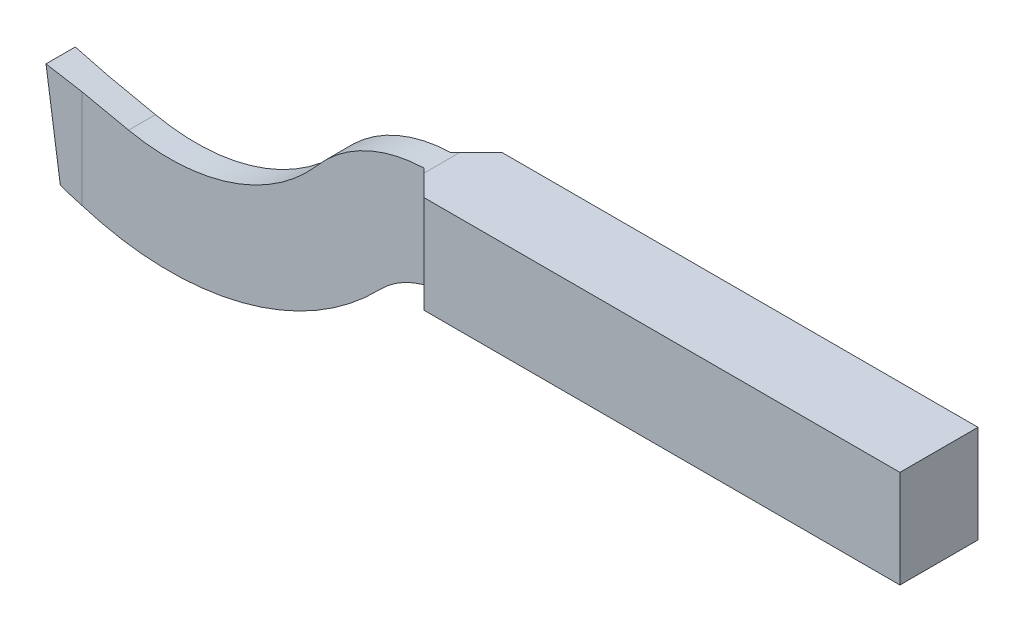
ISO-10303-21;
HEADER;
FILE_DESCRIPTION(('STEP AP214'),'2;1');
FILE_NAME('part.step','',(''),(''),'','','');
FILE_SCHEMA(('AUTOMOTIVE_DESIGN { 1 0 10303 214 1 1 1 1 }'));
ENDSEC;
DATA;
#1=APPLICATION_CONTEXT('core data for automotive mechanical design processes');
#2=APPLICATION_PROTOCOL_DEFINITION('international standard','automotive_design',2000,#1);
#3=PRODUCT_CONTEXT('',#1,'mechanical');
#4=PRODUCT('Part','Part','',(#3));
#5=PRODUCT_RELATED_PRODUCT_CATEGORY('part','',(#4));
#6=PRODUCT_DEFINITION_FORMATION('','',#4);
#7=PRODUCT_DEFINITION_CONTEXT('part definition',#1,'design');
#8=PRODUCT_DEFINITION('design','',#6,#7);
#9=PRODUCT_DEFINITION_SHAPE('','',#8);
#10=(LENGTH_UNIT() NAMED_UNIT(*) SI_UNIT(.MILLI.,.METRE.));
#11=(NAMED_UNIT(*) PLANE_ANGLE_UNIT() SI_UNIT($,.RADIAN.));
#12=(NAMED_UNIT(*) SI_UNIT($,.STERADIAN.) SOLID_ANGLE_UNIT());
#13=UNCERTAINTY_MEASURE_WITH_UNIT(LENGTH_MEASURE(1.E-05),#10,'distance_accuracy_value','');
#14=(GEOMETRIC_REPRESENTATION_CONTEXT(3) GLOBAL_UNCERTAINTY_ASSIGNED_CONTEXT((#13)) GLOBAL_UNIT_ASSIGNED_CONTEXT((#10,
#11,#12)) REPRESENTATION_CONTEXT('',''));
#15=CARTESIAN_POINT('',(0.,0.,0.));
#16=DIRECTION('',(0.,0.,1.));
#17=DIRECTION('',(1.,0.,0.));
#18=AXIS2_PLACEMENT_3D('',#15,#16,#17);
#19=CARTESIAN_POINT('',(0.,0.,32.));
#20=DIRECTION('',(-0.20791169081776,-0.978147600733806,0.));
#21=DIRECTION('',(0.978147600733806,-0.20791169081776,0.));
#22=AXIS2_PLACEMENT_3D('',#19,#20,#21);
#23=PLANE('',#22);
#24=DIRECTION('',(-0.977577474577886,0.20779050676234,0.0341377576500523));
#25=VECTOR('',#24,1.);
#26=CARTESIAN_POINT('',(-0.3337230291129,0.070935019618343,22.0116538649737));
#27=LINE('',#26,#25);
#28=CARTESIAN_POINT('',(14.3181266414594,-3.04341176846456,21.5));
#29=VERTEX_POINT('',#28);
#30=CARTESIAN_POINT('',(0.,-3.53883589099269E-13,22.));
#31=VERTEX_POINT('',#30);
#32=EDGE_CURVE('E139',#29,#31,#27,.T.);
#33=ORIENTED_EDGE('',*,*,#32,.F.);
#34=DIRECTION('',(-0.978147600733806,0.20791169081776,0.));
#35=VECTOR('',#34,1.);
#36=CARTESIAN_POINT('',(0.,0.,21.5));
#37=LINE('',#36,#35);
#38=CARTESIAN_POINT('',(33.3670647345792,-7.09238855300323,21.5));
#39=VERTEX_POINT('',#38);
#40=EDGE_CURVE('E271',#39,#29,#37,.T.);
#41=ORIENTED_EDGE('',*,*,#40,.F.);
#42=DIRECTION('',(0.,0.,-1.));
#43=VECTOR('',#42,1.);
#44=CARTESIAN_POINT('',(33.3670647345792,-7.09238855300323,32.));
#45=LINE('',#44,#43);
#46=CARTESIAN_POINT('',(33.3670647345792,-7.09238855300323,10.5));
#47=VERTEX_POINT('',#46);
#48=EDGE_CURVE('E177',#39,#47,#45,.T.);
#49=ORIENTED_EDGE('',*,*,#48,.T.);
#50=DIRECTION('',(-0.978147600733806,0.20791169081776,0.));
#51=VECTOR('',#50,1.);
#52=CARTESIAN_POINT('',(0.,0.,10.5));
#53=LINE('',#52,#51);
#54=CARTESIAN_POINT('',(14.3181266414591,-3.0434117684645,10.5));
#55=VERTEX_POINT('',#54);
#56=EDGE_CURVE('E189',#47,#55,#53,.T.);
#57=ORIENTED_EDGE('',*,*,#56,.T.);
#58=DIRECTION('',(-0.977577474577885,0.20779050676234,-0.0341377576500593));
#59=VECTOR('',#58,1.);
#60=CARTESIAN_POINT('',(0.73419066404853,-0.156057043160386,10.0256385029422));
#61=LINE('',#60,#59);
#62=CARTESIAN_POINT('',(0.,0.,10.));
#63=VERTEX_POINT('',#62);
#64=EDGE_CURVE('E162',#55,#63,#61,.T.);
#65=ORIENTED_EDGE('',*,*,#64,.T.);
#66=DIRECTION('',(0.,0.,-1.));
#67=VECTOR('',#66,1.);
#68=CARTESIAN_POINT('',(0.,0.,32.));
#69=LINE('',#68,#67);
#70=EDGE_CURVE('E156',#31,#63,#69,.T.);
#71=ORIENTED_EDGE('',*,*,#70,.F.);
#72=EDGE_LOOP('',(#33,#41,#49,#57,#65,#71));
#73=FACE_BOUND('',#72,.T.);
#74=ADVANCED_FACE('F33',(#73),#23,.F.);
#75=CARTESIAN_POINT('',(0.,0.,32.));
#76=DIRECTION('',(0.99026806874157,0.139173100960066,0.));
#77=DIRECTION('',(-0.139173100960066,0.99026806874157,0.));
#78=AXIS2_PLACEMENT_3D('',#75,#76,#77);
#79=PLANE('',#78);
#80=DIRECTION('',(0.139171457361201,-0.990256373927965,-0.0048599743823401));
#81=VECTOR('',#80,1.);
#82=CARTESIAN_POINT('',(-0.00676369717528373,0.0481262060923891,22.00023619351));
#83=LINE('',#82,#81);
#84=CARTESIAN_POINT('',(5.67120540009934,-40.3527231932884,21.8019571434828));
#85=VERTEX_POINT('',#84);
#86=EDGE_CURVE('E142',#31,#85,#83,.T.);
#87=ORIENTED_EDGE('',*,*,#86,.F.);
#88=ORIENTED_EDGE('',*,*,#70,.T.);
#89=DIRECTION('',(0.139171457361201,-0.990256373927965,0.00485997438234109));
#90=VECTOR('',#89,1.);
#91=CARTESIAN_POINT('',(0.0148801337856272,-0.105877653403278,10.0005196257219));
#92=LINE('',#91,#90);
#93=CARTESIAN_POINT('',(5.67120540009934,-40.3527231932884,10.1980428565172));
#94=VERTEX_POINT('',#93);
#95=EDGE_CURVE('E197',#63,#94,#92,.T.);
#96=ORIENTED_EDGE('',*,*,#95,.T.);
#97=DIRECTION('',(0.,0.,-1.));
#98=VECTOR('',#97,1.);
#99=CARTESIAN_POINT('',(5.67120540009934,-40.3527231932884,32.));
#100=LINE('',#99,#98);
#101=EDGE_CURVE('E157',#85,#94,#100,.T.);
#102=ORIENTED_EDGE('',*,*,#101,.F.);
#103=EDGE_LOOP('',(#87,#88,#96,#102));
#104=FACE_BOUND('',#103,.T.);
#105=ADVANCED_FACE('F154',(#104),#79,.F.);
#106=CARTESIAN_POINT('',(50.,71.1594195057012,32.));
#107=DIRECTION('',(0.,0.,-1.));
#108=DIRECTION('',(-1.,0.,0.));
#109=AXIS2_PLACEMENT_3D('',#106,#107,#108);
#110=CYLINDRICAL_SURFACE('',#109,120.);
#111=CARTESIAN_POINT('',(50.,71.1594195057012,20.253961525413));
#112=DIRECTION('',(0.0348994967024939,0.,0.999390827019096));
#113=DIRECTION('',(0.999390827019096,0.,-0.0348994967024939));
#114=AXIS2_PLACEMENT_3D('',#111,#112,#113);
#115=ELLIPSE('',#114,120.073145315859,120.);
#116=CARTESIAN_POINT('',(14.3181266414594,-43.4128455222062,21.5));
#117=VERTEX_POINT('',#116);
#118=EDGE_CURVE('E158',#85,#117,#115,.T.);
#119=ORIENTED_EDGE('',*,*,#118,.F.);
#120=ORIENTED_EDGE('',*,*,#101,.T.);
#121=CARTESIAN_POINT('',(50.,71.1594195057012,11.7460384745874));
#122=DIRECTION('',(-0.034899496702501,0.,0.999390827019096));
#123=DIRECTION('',(-0.999390827019096,0.,-0.034899496702501));
#124=AXIS2_PLACEMENT_3D('',#121,#122,#123);
#125=ELLIPSE('',#124,120.073145315859,120.);
#126=CARTESIAN_POINT('',(14.3181266414591,-43.4128455222061,10.5));
#127=VERTEX_POINT('',#126);
#128=EDGE_CURVE('E259',#94,#127,#125,.T.);
#129=ORIENTED_EDGE('',*,*,#128,.T.);
#130=CARTESIAN_POINT('',(50.,71.1594195057012,10.5));
#131=DIRECTION('',(0.,0.,1.));
#132=DIRECTION('',(1.,0.,0.));
#133=AXIS2_PLACEMENT_3D('',#130,#131,#132);
#134=CIRCLE('',#133,120.);
#135=CARTESIAN_POINT('',(136.310576950481,-12.2101451235747,10.5));
#136=VERTEX_POINT('',#135);
#137=EDGE_CURVE('E203',#127,#136,#134,.T.);
#138=ORIENTED_EDGE('',*,*,#137,.T.);
#139=DIRECTION('',(0.,0.,-1.));
#140=VECTOR('',#139,1.);
#141=CARTESIAN_POINT('',(136.310576950481,-12.2101451235747,32.));
#142=LINE('',#141,#140);
#143=CARTESIAN_POINT('',(136.310576950481,-12.2101451235747,21.5));
#144=VERTEX_POINT('',#143);
#145=EDGE_CURVE('E167',#144,#136,#142,.T.);
#146=ORIENTED_EDGE('',*,*,#145,.F.);
#147=CARTESIAN_POINT('',(50.,71.1594195057012,21.5));
#148=DIRECTION('',(0.,0.,1.));
#149=DIRECTION('',(1.,0.,0.));
#150=AXIS2_PLACEMENT_3D('',#147,#148,#149);
#151=CIRCLE('',#150,120.);
#152=EDGE_CURVE('E265',#117,#144,#151,.T.);
#153=ORIENTED_EDGE('',*,*,#152,.F.);
#154=EDGE_LOOP('',(#119,#120,#129,#138,#146,#153));
#155=FACE_BOUND('',#154,.T.);
#156=ADVANCED_FACE('F257',(#155),#110,.T.);
#157=CARTESIAN_POINT('',(165.080769267309,-40.,32.));
#158=DIRECTION('',(0.,0.,-1.));
#159=DIRECTION('',(-1.,0.,0.));
#160=AXIS2_PLACEMENT_3D('',#157,#158,#159);
#161=CYLINDRICAL_SURFACE('',#160,40.);
#162=CARTESIAN_POINT('',(165.080769267309,-40.,21.5));
#163=DIRECTION('',(0.,0.,1.));
#164=DIRECTION('',(1.,0.,0.));
#165=AXIS2_PLACEMENT_3D('',#162,#163,#164);
#166=CIRCLE('',#165,40.);
#167=CARTESIAN_POINT('',(154.5,-1.42478358178688,21.5));
#168=VERTEX_POINT('',#167);
#169=EDGE_CURVE('E253',#144,#168,#166,.F.);
#170=ORIENTED_EDGE('',*,*,#169,.F.);
#171=ORIENTED_EDGE('',*,*,#145,.T.);
#172=CARTESIAN_POINT('',(165.080769267309,-40.,10.5));
#173=DIRECTION('',(0.,0.,1.));
#174=DIRECTION('',(1.,0.,0.));
#175=AXIS2_PLACEMENT_3D('',#172,#173,#174);
#176=CIRCLE('',#175,40.);
#177=CARTESIAN_POINT('',(154.5,-1.42478358178696,10.5));
#178=VERTEX_POINT('',#177);
#179=EDGE_CURVE('E195',#136,#178,#176,.F.);
#180=ORIENTED_EDGE('',*,*,#179,.T.);
#181=CARTESIAN_POINT('',(165.080769267309,-40.,-0.0807692673088153));
#182=DIRECTION('',(-0.707106781186553,0.,-0.707106781186542));
#183=DIRECTION('',(0.707106781186542,0.,-0.707106781186553));
#184=AXIS2_PLACEMENT_3D('',#181,#182,#183);
#185=ELLIPSE('',#184,56.5685424949243,40.);
#186=CARTESIAN_POINT('',(165.,-8.15460148850811E-05,0.));
#187=VERTEX_POINT('',#186);
#188=EDGE_CURVE('E214',#187,#178,#185,.F.);
#189=ORIENTED_EDGE('',*,*,#188,.F.);
#190=CARTESIAN_POINT('',(165.080769267309,-40.,0.));
#191=DIRECTION('',(0.,0.,-1.));
#192=DIRECTION('',(-1.,0.,0.));
#193=AXIS2_PLACEMENT_3D('',#190,#191,#192);
#194=CIRCLE('',#193,40.);
#195=CARTESIAN_POINT('',(165.080769267309,0.,0.));
#196=VERTEX_POINT('',#195);
#197=EDGE_CURVE('E216',#187,#196,#194,.T.);
#198=ORIENTED_EDGE('',*,*,#197,.T.);
#199=DIRECTION('',(0.,0.,-1.));
#200=VECTOR('',#199,1.);
#201=CARTESIAN_POINT('',(165.080769267309,0.,32.));
#202=LINE('',#201,#200);
#203=CARTESIAN_POINT('',(165.080769267309,0.,32.));
#204=VERTEX_POINT('',#203);
#205=EDGE_CURVE('E244',#204,#196,#202,.T.);
#206=ORIENTED_EDGE('',*,*,#205,.F.);
#207=CARTESIAN_POINT('',(165.080769267309,-40.,32.));
#208=DIRECTION('',(0.,0.,-1.));
#209=DIRECTION('',(-1.,0.,0.));
#210=AXIS2_PLACEMENT_3D('',#207,#208,#209);
#211=CIRCLE('',#210,40.);
#212=CARTESIAN_POINT('',(165.,-8.15460148850811E-05,32.));
#213=VERTEX_POINT('',#212);
#214=EDGE_CURVE('E217',#213,#204,#211,.T.);
#215=ORIENTED_EDGE('',*,*,#214,.F.);
#216=CARTESIAN_POINT('',(165.080769267309,-40.,32.0807692673084));
#217=DIRECTION('',(-0.707106781186541,0.,0.707106781186554));
#218=DIRECTION('',(-0.707106781186554,0.,-0.707106781186541));
#219=AXIS2_PLACEMENT_3D('',#216,#217,#218);
#220=ELLIPSE('',#219,56.5685424949233,40.);
#221=EDGE_CURVE('E47',#168,#213,#220,.F.);
#222=ORIENTED_EDGE('',*,*,#221,.F.);
#223=EDGE_LOOP('',(#170,#171,#180,#189,#198,#206,#215,#222));
#224=FACE_BOUND('',#223,.T.);
#225=ADVANCED_FACE('F249',(#224),#161,.F.);
#226=CARTESIAN_POINT('',(156.254224553114,-20.,32.));
#227=DIRECTION('',(0.,0.,-1.));
#228=DIRECTION('',(-1.,0.,0.));
#229=AXIS2_PLACEMENT_3D('',#226,#227,#228);
#230=CYLINDRICAL_SURFACE('',#229,60.);
#231=CARTESIAN_POINT('',(156.254224553114,-20.,21.5));
#232=DIRECTION('',(0.,0.,1.));
#233=DIRECTION('',(1.,0.,0.));
#234=AXIS2_PLACEMENT_3D('',#231,#232,#233);
#235=CIRCLE('',#234,60.);
#236=CARTESIAN_POINT('',(154.5,39.9743503192594,21.5));
#237=VERTEX_POINT('',#236);
#238=CARTESIAN_POINT('',(110.716699744637,19.0683226453005,21.5));
#239=VERTEX_POINT('',#238);
#240=EDGE_CURVE('E149',#237,#239,#235,.T.);
#241=ORIENTED_EDGE('',*,*,#240,.F.);
#242=CARTESIAN_POINT('',(156.254224553114,-20.,23.254224553114));
#243=DIRECTION('',(-0.707106781186541,0.,0.707106781186554));
#244=DIRECTION('',(-0.707106781186554,0.,-0.707106781186541));
#245=AXIS2_PLACEMENT_3D('',#242,#243,#244);
#246=ELLIPSE('',#245,84.8528137423849,60.);
#247=CARTESIAN_POINT('',(156.254224553114,40.,23.254224553114));
#248=VERTEX_POINT('',#247);
#249=EDGE_CURVE('E209',#248,#237,#246,.T.);
#250=ORIENTED_EDGE('',*,*,#249,.F.);
#251=DIRECTION('',(0.,0.,-1.));
#252=VECTOR('',#251,1.);
#253=CARTESIAN_POINT('',(156.254224553114,40.,32.));
#254=LINE('',#253,#252);
#255=CARTESIAN_POINT('',(156.254224553114,40.,8.74577544688594));
#256=VERTEX_POINT('',#255);
#257=EDGE_CURVE('E236',#248,#256,#254,.T.);
#258=ORIENTED_EDGE('',*,*,#257,.T.);
#259=CARTESIAN_POINT('',(156.254224553114,-20.,8.74577544688593));
#260=DIRECTION('',(-0.707106781186553,0.,-0.707106781186542));
#261=DIRECTION('',(0.707106781186542,0.,-0.707106781186553));
#262=AXIS2_PLACEMENT_3D('',#259,#260,#261);
#263=ELLIPSE('',#262,84.8528137423864,60.);
#264=CARTESIAN_POINT('',(154.5,39.9743503192594,10.5));
#265=VERTEX_POINT('',#264);
#266=EDGE_CURVE('E193',#265,#256,#263,.T.);
#267=ORIENTED_EDGE('',*,*,#266,.F.);
#268=CARTESIAN_POINT('',(156.254224553114,-20.,10.5));
#269=DIRECTION('',(0.,0.,1.));
#270=DIRECTION('',(1.,0.,0.));
#271=AXIS2_PLACEMENT_3D('',#268,#269,#270);
#272=CIRCLE('',#271,60.);
#273=CARTESIAN_POINT('',(110.716699744637,19.0683226453005,10.5));
#274=VERTEX_POINT('',#273);
#275=EDGE_CURVE('E187',#265,#274,#272,.T.);
#276=ORIENTED_EDGE('',*,*,#275,.T.);
#277=DIRECTION('',(0.,0.,-1.));
#278=VECTOR('',#277,1.);
#279=CARTESIAN_POINT('',(110.716699744637,19.0683226453005,32.));
#280=LINE('',#279,#278);
#281=EDGE_CURVE('E179',#239,#274,#280,.T.);
#282=ORIENTED_EDGE('',*,*,#281,.F.);
#283=EDGE_LOOP('',(#241,#250,#258,#267,#276,#282));
#284=FACE_BOUND('',#283,.T.);
#285=ADVANCED_FACE('F192',(#284),#230,.T.);
#286=CARTESIAN_POINT('',(50.,71.1594195057012,32.));
#287=DIRECTION('',(0.,0.,-1.));
#288=DIRECTION('',(-1.,0.,0.));
#289=AXIS2_PLACEMENT_3D('',#286,#287,#288);
#290=CYLINDRICAL_SURFACE('',#289,80.);
#291=CARTESIAN_POINT('',(50.,71.1594195057012,21.5));
#292=DIRECTION('',(0.,0.,1.));
#293=DIRECTION('',(1.,0.,0.));
#294=AXIS2_PLACEMENT_3D('',#291,#292,#293);
#295=CIRCLE('',#294,80.);
#296=EDGE_CURVE('E11',#239,#39,#295,.F.);
#297=ORIENTED_EDGE('',*,*,#296,.F.);
#298=ORIENTED_EDGE('',*,*,#281,.T.);
#299=CARTESIAN_POINT('',(50.,71.1594195057012,10.5));
#300=DIRECTION('',(0.,0.,1.));
#301=DIRECTION('',(1.,0.,0.));
#302=AXIS2_PLACEMENT_3D('',#299,#300,#301);
#303=CIRCLE('',#302,80.);
#304=EDGE_CURVE('E40',#274,#47,#303,.F.);
#305=ORIENTED_EDGE('',*,*,#304,.T.);
#306=ORIENTED_EDGE('',*,*,#48,.F.);
#307=EDGE_LOOP('',(#297,#298,#305,#306));
#308=FACE_BOUND('',#307,.T.);
#309=ADVANCED_FACE('F176',(#308),#290,.F.);
#310=CARTESIAN_POINT('',(360.,40.,32.));
#311=DIRECTION('',(0.,-1.,0.));
#312=DIRECTION('',(1.,0.,0.));
#313=AXIS2_PLACEMENT_3D('',#310,#311,#312);
#314=PLANE('',#313);
#315=DIRECTION('',(0.707106781186554,0.,0.707106781186541));
#316=VECTOR('',#315,1.);
#317=CARTESIAN_POINT('',(66.4999999999986,40.,-66.4999999999998));
#318=LINE('',#317,#316);
#319=CARTESIAN_POINT('',(165.,40.,32.));
#320=VERTEX_POINT('',#319);
#321=EDGE_CURVE('E206',#248,#320,#318,.T.);
#322=ORIENTED_EDGE('',*,*,#321,.T.);
#323=DIRECTION('',(-1.,0.,0.));
#324=VECTOR('',#323,1.);
#325=CARTESIAN_POINT('',(360.,40.,32.));
#326=LINE('',#325,#324);
#327=CARTESIAN_POINT('',(360.,40.,32.));
#328=VERTEX_POINT('',#327);
#329=EDGE_CURVE('E224',#328,#320,#326,.T.);
#330=ORIENTED_EDGE('',*,*,#329,.F.);
#331=DIRECTION('',(0.,0.,-1.));
#332=VECTOR('',#331,1.);
#333=CARTESIAN_POINT('',(360.,40.,32.));
#334=LINE('',#333,#332);
#335=CARTESIAN_POINT('',(360.,40.,0.));
#336=VERTEX_POINT('',#335);
#337=EDGE_CURVE('E238',#328,#336,#334,.T.);
#338=ORIENTED_EDGE('',*,*,#337,.T.);
#339=DIRECTION('',(-1.,0.,0.));
#340=VECTOR('',#339,1.);
#341=CARTESIAN_POINT('',(360.,40.,0.));
#342=LINE('',#341,#340);
#343=CARTESIAN_POINT('',(165.,40.,0.));
#344=VERTEX_POINT('',#343);
#345=EDGE_CURVE('E220',#336,#344,#342,.T.);
#346=ORIENTED_EDGE('',*,*,#345,.T.);
#347=DIRECTION('',(-0.707106781186542,0.,0.707106781186553));
#348=VECTOR('',#347,1.);
#349=CARTESIAN_POINT('',(82.5000000000013,40.,82.4999999999999));
#350=LINE('',#349,#348);
#351=EDGE_CURVE('E55',#344,#256,#350,.T.);
#352=ORIENTED_EDGE('',*,*,#351,.T.);
#353=ORIENTED_EDGE('',*,*,#257,.F.);
#354=EDGE_LOOP('',(#322,#330,#338,#346,#352,#353));
#355=FACE_BOUND('',#354,.T.);
#356=ADVANCED_FACE('F284',(#355),#314,.F.);
#357=CARTESIAN_POINT('',(50.,71.1594195057012,32.));
#358=DIRECTION('',(0.,0.,1.));
#359=DIRECTION('',(1.,0.,0.));
#360=AXIS2_PLACEMENT_3D('',#357,#358,#359);
#361=PLANE('',#360);
#362=ORIENTED_EDGE('',*,*,#329,.T.);
#363=DIRECTION('',(0.,-1.,0.));
#364=VECTOR('',#363,1.);
#365=CARTESIAN_POINT('',(165.,71.1594195057013,32.));
#366=LINE('',#365,#364);
#367=EDGE_CURVE('E165',#320,#213,#366,.T.);
#368=ORIENTED_EDGE('',*,*,#367,.T.);
#369=ORIENTED_EDGE('',*,*,#214,.T.);
#370=DIRECTION('',(1.,0.,0.));
#371=VECTOR('',#370,1.);
#372=CARTESIAN_POINT('',(165.080769267309,0.,32.));
#373=LINE('',#372,#371);
#374=CARTESIAN_POINT('',(360.,0.,32.));
#375=VERTEX_POINT('',#374);
#376=EDGE_CURVE('E219',#204,#375,#373,.T.);
#377=ORIENTED_EDGE('',*,*,#376,.T.);
#378=DIRECTION('',(0.,1.,0.));
#379=VECTOR('',#378,1.);
#380=CARTESIAN_POINT('',(360.,0.,32.));
#381=LINE('',#380,#379);
#382=EDGE_CURVE('E222',#375,#328,#381,.T.);
#383=ORIENTED_EDGE('',*,*,#382,.T.);
#384=EDGE_LOOP('',(#362,#368,#369,#377,#383));
#385=FACE_BOUND('',#384,.T.);
#386=ADVANCED_FACE('F302',(#385),#361,.T.);
#387=CARTESIAN_POINT('',(50.,71.1594195057012,0.));
#388=DIRECTION('',(0.,0.,1.));
#389=DIRECTION('',(1.,0.,0.));
#390=AXIS2_PLACEMENT_3D('',#387,#388,#389);
#391=PLANE('',#390);
#392=DIRECTION('',(0.,-1.,0.));
#393=VECTOR('',#392,1.);
#394=CARTESIAN_POINT('',(165.,71.1594195057013,0.));
#395=LINE('',#394,#393);
#396=EDGE_CURVE('E163',#344,#187,#395,.T.);
#397=ORIENTED_EDGE('',*,*,#396,.F.);
#398=ORIENTED_EDGE('',*,*,#345,.F.);
#399=DIRECTION('',(0.,1.,0.));
#400=VECTOR('',#399,1.);
#401=CARTESIAN_POINT('',(360.,0.,0.));
#402=LINE('',#401,#400);
#403=CARTESIAN_POINT('',(360.,0.,0.));
#404=VERTEX_POINT('',#403);
#405=EDGE_CURVE('E230',#404,#336,#402,.T.);
#406=ORIENTED_EDGE('',*,*,#405,.F.);
#407=DIRECTION('',(1.,0.,0.));
#408=VECTOR('',#407,1.);
#409=CARTESIAN_POINT('',(165.080769267309,0.,0.));
#410=LINE('',#409,#408);
#411=EDGE_CURVE('E228',#196,#404,#410,.T.);
#412=ORIENTED_EDGE('',*,*,#411,.F.);
#413=ORIENTED_EDGE('',*,*,#197,.F.);
#414=EDGE_LOOP('',(#397,#398,#406,#412,#413));
#415=FACE_BOUND('',#414,.T.);
#416=ADVANCED_FACE('F290',(#415),#391,.F.);
#417=CARTESIAN_POINT('',(165.080769267309,0.,32.));
#418=DIRECTION('',(0.,1.,0.));
#419=DIRECTION('',(0.,0.,1.));
#420=AXIS2_PLACEMENT_3D('',#417,#418,#419);
#421=PLANE('',#420);
#422=ORIENTED_EDGE('',*,*,#411,.T.);
#423=DIRECTION('',(0.,0.,-1.));
#424=VECTOR('',#423,1.);
#425=CARTESIAN_POINT('',(360.,0.,32.));
#426=LINE('',#425,#424);
#427=EDGE_CURVE('E241',#375,#404,#426,.T.);
#428=ORIENTED_EDGE('',*,*,#427,.F.);
#429=ORIENTED_EDGE('',*,*,#376,.F.);
#430=ORIENTED_EDGE('',*,*,#205,.T.);
#431=EDGE_LOOP('',(#422,#428,#429,#430));
#432=FACE_BOUND('',#431,.T.);
#433=ADVANCED_FACE('F298',(#432),#421,.F.);
#434=CARTESIAN_POINT('',(360.,0.,32.));
#435=DIRECTION('',(-1.,0.,0.));
#436=DIRECTION('',(0.,0.,1.));
#437=AXIS2_PLACEMENT_3D('',#434,#435,#436);
#438=PLANE('',#437);
#439=ORIENTED_EDGE('',*,*,#405,.T.);
#440=ORIENTED_EDGE('',*,*,#337,.F.);
#441=ORIENTED_EDGE('',*,*,#382,.F.);
#442=ORIENTED_EDGE('',*,*,#427,.T.);
#443=EDGE_LOOP('',(#439,#440,#441,#442));
#444=FACE_BOUND('',#443,.T.);
#445=ADVANCED_FACE('F311',(#444),#438,.F.);
#446=CARTESIAN_POINT('',(82.5000000000013,-48.8405804942988,82.4999999999999));
#447=DIRECTION('',(-0.707106781186553,0.,-0.707106781186542));
#448=DIRECTION('',(-0.707106781186542,0.,0.707106781186553));
#449=AXIS2_PLACEMENT_3D('',#446,#447,#448);
#450=PLANE('',#449);
#451=ORIENTED_EDGE('',*,*,#188,.T.);
#452=DIRECTION('',(0.,1.,0.));
#453=VECTOR('',#452,1.);
#454=CARTESIAN_POINT('',(154.5,-48.8405804942988,10.5));
#455=LINE('',#454,#453);
#456=EDGE_CURVE('E261',#178,#265,#455,.T.);
#457=ORIENTED_EDGE('',*,*,#456,.T.);
#458=ORIENTED_EDGE('',*,*,#266,.T.);
#459=ORIENTED_EDGE('',*,*,#351,.F.);
#460=ORIENTED_EDGE('',*,*,#396,.T.);
#461=EDGE_LOOP('',(#451,#457,#458,#459,#460));
#462=FACE_BOUND('',#461,.T.);
#463=ADVANCED_FACE('F293',(#462),#450,.T.);
#464=CARTESIAN_POINT('',(66.4999999999987,-48.8405804942988,-66.4999999999998));
#465=DIRECTION('',(-0.707106781186541,0.,0.707106781186554));
#466=DIRECTION('',(0.707106781186554,0.,0.707106781186541));
#467=AXIS2_PLACEMENT_3D('',#464,#465,#466);
#468=PLANE('',#467);
#469=ORIENTED_EDGE('',*,*,#221,.T.);
#470=ORIENTED_EDGE('',*,*,#367,.F.);
#471=ORIENTED_EDGE('',*,*,#321,.F.);
#472=ORIENTED_EDGE('',*,*,#249,.T.);
#473=DIRECTION('',(0.,1.,0.));
#474=VECTOR('',#473,1.);
#475=CARTESIAN_POINT('',(154.5,-48.8405804942988,21.5));
#476=LINE('',#475,#474);
#477=EDGE_CURVE('E277',#168,#237,#476,.T.);
#478=ORIENTED_EDGE('',*,*,#477,.F.);
#479=EDGE_LOOP('',(#469,#470,#471,#472,#478));
#480=FACE_BOUND('',#479,.T.);
#481=ADVANCED_FACE('F303',(#480),#468,.T.);
#482=CARTESIAN_POINT('',(0.,-48.8405804942988,10.5));
#483=DIRECTION('',(0.,0.,1.));
#484=DIRECTION('',(1.,0.,0.));
#485=AXIS2_PLACEMENT_3D('',#482,#483,#484);
#486=PLANE('',#485);
#487=DIRECTION('',(0.,1.,0.));
#488=VECTOR('',#487,1.);
#489=CARTESIAN_POINT('',(14.3181266414591,-48.8405804942988,10.5));
#490=LINE('',#489,#488);
#491=EDGE_CURVE('E262',#127,#55,#490,.T.);
#492=ORIENTED_EDGE('',*,*,#491,.T.);
#493=ORIENTED_EDGE('',*,*,#56,.F.);
#494=ORIENTED_EDGE('',*,*,#304,.F.);
#495=ORIENTED_EDGE('',*,*,#275,.F.);
#496=ORIENTED_EDGE('',*,*,#456,.F.);
#497=ORIENTED_EDGE('',*,*,#179,.F.);
#498=ORIENTED_EDGE('',*,*,#137,.F.);
#499=EDGE_LOOP('',(#492,#493,#494,#495,#496,#497,#498));
#500=FACE_BOUND('',#499,.T.);
#501=ADVANCED_FACE('F185',(#500),#486,.F.);
#502=CARTESIAN_POINT('',(-0.348782368720619,-48.8405804942988,9.98782025129912));
#503=DIRECTION('',(-0.034899496702501,0.,0.999390827019096));
#504=DIRECTION('',(0.999390827019096,0.,0.034899496702501));
#505=AXIS2_PLACEMENT_3D('',#502,#503,#504);
#506=PLANE('',#505);
#507=ORIENTED_EDGE('',*,*,#491,.F.);
#508=ORIENTED_EDGE('',*,*,#128,.F.);
#509=ORIENTED_EDGE('',*,*,#95,.F.);
#510=ORIENTED_EDGE('',*,*,#64,.F.);
#511=EDGE_LOOP('',(#507,#508,#509,#510));
#512=FACE_BOUND('',#511,.T.);
#513=ADVANCED_FACE('F270',(#512),#506,.F.);
#514=CARTESIAN_POINT('',(0.,-48.8405804942988,21.5));
#515=DIRECTION('',(0.,0.,1.));
#516=DIRECTION('',(1.,0.,0.));
#517=AXIS2_PLACEMENT_3D('',#514,#515,#516);
#518=PLANE('',#517);
#519=ORIENTED_EDGE('',*,*,#152,.T.);
#520=ORIENTED_EDGE('',*,*,#169,.T.);
#521=ORIENTED_EDGE('',*,*,#477,.T.);
#522=ORIENTED_EDGE('',*,*,#240,.T.);
#523=ORIENTED_EDGE('',*,*,#296,.T.);
#524=ORIENTED_EDGE('',*,*,#40,.T.);
#525=DIRECTION('',(0.,1.,0.));
#526=VECTOR('',#525,1.);
#527=CARTESIAN_POINT('',(14.3181266414594,-48.8405804942988,21.5));
#528=LINE('',#527,#526);
#529=EDGE_CURVE('E145',#117,#29,#528,.T.);
#530=ORIENTED_EDGE('',*,*,#529,.F.);
#531=EDGE_LOOP('',(#519,#520,#521,#522,#523,#524,#530));
#532=FACE_BOUND('',#531,.T.);
#533=ADVANCED_FACE('F280',(#532),#518,.T.);
#534=CARTESIAN_POINT('',(0.767321211185232,-48.8405804942988,21.9732045528581));
#535=DIRECTION('',(0.0348994967024939,0.,0.999390827019096));
#536=DIRECTION('',(0.999390827019096,0.,-0.0348994967024939));
#537=AXIS2_PLACEMENT_3D('',#534,#535,#536);
#538=PLANE('',#537);
#539=ORIENTED_EDGE('',*,*,#32,.T.);
#540=ORIENTED_EDGE('',*,*,#86,.T.);
#541=ORIENTED_EDGE('',*,*,#118,.T.);
#542=ORIENTED_EDGE('',*,*,#529,.T.);
#543=EDGE_LOOP('',(#539,#540,#541,#542));
#544=FACE_BOUND('',#543,.T.);
#545=ADVANCED_FACE('F141',(#544),#538,.T.);
#546=CLOSED_SHELL('',(#74,#105,#156,#225,#285,#309,#356,#386,#416,#433,#445,#463,#481,#501,#513,
#533,#545));
#547=MANIFOLD_SOLID_BREP('B2',#546);
#548=ADVANCED_BREP_SHAPE_REPRESENTATION('',(#18,#547),#14);
#549=SHAPE_DEFINITION_REPRESENTATION(#9,#548);
ENDSEC;
END-ISO-10303-21;
